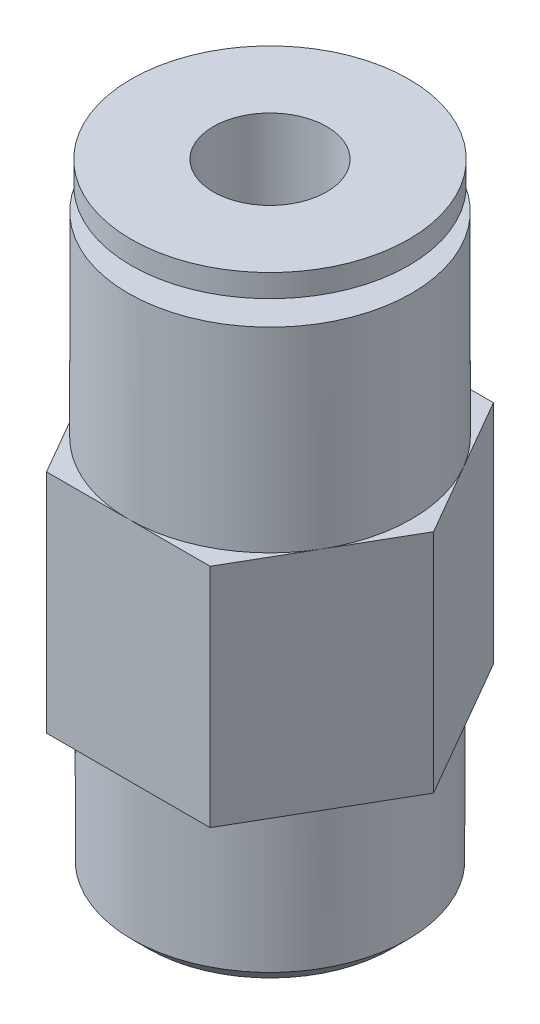
ISO-10303-21;
HEADER;
FILE_DESCRIPTION(('STEP AP214'),'2;1');
FILE_NAME('part.step','',(''),(''),'','','');
FILE_SCHEMA(('AUTOMOTIVE_DESIGN { 1 0 10303 214 1 1 1 1 }'));
ENDSEC;
DATA;
#1=APPLICATION_CONTEXT('core data for automotive mechanical design processes');
#2=APPLICATION_PROTOCOL_DEFINITION('international standard','automotive_design',2000,#1);
#3=PRODUCT_CONTEXT('',#1,'mechanical');
#4=PRODUCT('Part','Part','',(#3));
#5=PRODUCT_RELATED_PRODUCT_CATEGORY('part','',(#4));
#6=PRODUCT_DEFINITION_FORMATION('','',#4);
#7=PRODUCT_DEFINITION_CONTEXT('part definition',#1,'design');
#8=PRODUCT_DEFINITION('design','',#6,#7);
#9=PRODUCT_DEFINITION_SHAPE('','',#8);
#10=(LENGTH_UNIT() NAMED_UNIT(*) SI_UNIT(.MILLI.,.METRE.));
#11=(NAMED_UNIT(*) PLANE_ANGLE_UNIT() SI_UNIT($,.RADIAN.));
#12=(NAMED_UNIT(*) SI_UNIT($,.STERADIAN.) SOLID_ANGLE_UNIT());
#13=UNCERTAINTY_MEASURE_WITH_UNIT(LENGTH_MEASURE(1.E-05),#10,'distance_accuracy_value','');
#14=(GEOMETRIC_REPRESENTATION_CONTEXT(3) GLOBAL_UNCERTAINTY_ASSIGNED_CONTEXT((#13)) GLOBAL_UNIT_ASSIGNED_CONTEXT((#10,
#11,#12)) REPRESENTATION_CONTEXT('',''));
#15=CARTESIAN_POINT('',(0.,0.,0.));
#16=DIRECTION('',(0.,0.,1.));
#17=DIRECTION('',(1.,0.,0.));
#18=AXIS2_PLACEMENT_3D('',#15,#16,#17);
#19=CARTESIAN_POINT('',(4.33642210820387,0.,-4.285));
#20=DIRECTION('',(0.,-1.,0.));
#21=DIRECTION('',(0.,0.,1.));
#22=AXIS2_PLACEMENT_3D('',#19,#20,#21);
#23=PLANE('',#22);
#24=CARTESIAN_POINT('',(0.,0.,0.));
#25=DIRECTION('',(0.,1.,0.));
#26=DIRECTION('',(0.,0.,1.));
#27=AXIS2_PLACEMENT_3D('',#24,#25,#26);
#28=CIRCLE('',#27,4.28499999999999);
#29=CARTESIAN_POINT('',(0.,0.,4.28499999999999));
#30=VERTEX_POINT('',#29);
#31=EDGE_CURVE('E19',#30,#30,#28,.T.);
#32=ORIENTED_EDGE('',*,*,#31,.F.);
#33=EDGE_LOOP('',(#32));
#34=FACE_BOUND('',#33,.T.);
#35=ADVANCED_FACE('F16',(#34),#23,.T.);
#36=CARTESIAN_POINT('',(0.,0.,0.));
#37=DIRECTION('',(0.,1.,0.));
#38=DIRECTION('',(0.,0.,1.));
#39=AXIS2_PLACEMENT_3D('',#36,#37,#38);
#40=CONICAL_SURFACE('',#39,4.28499999999999,0.785398163397448);
#41=CARTESIAN_POINT('',(0.,0.58,0.));
#42=DIRECTION('',(0.,1.,0.));
#43=DIRECTION('',(0.,0.,-1.));
#44=AXIS2_PLACEMENT_3D('',#41,#42,#43);
#45=CIRCLE('',#44,4.865);
#46=CARTESIAN_POINT('',(0.,0.58,-4.865));
#47=VERTEX_POINT('',#46);
#48=EDGE_CURVE('E148',#47,#47,#45,.T.);
#49=ORIENTED_EDGE('',*,*,#48,.F.);
#50=EDGE_LOOP('',(#49));
#51=FACE_BOUND('',#50,.T.);
#52=ORIENTED_EDGE('',*,*,#31,.T.);
#53=EDGE_LOOP('',(#52));
#54=FACE_BOUND('',#53,.T.);
#55=ADVANCED_FACE('F418',(#51,#54),#40,.T.);
#56=CARTESIAN_POINT('',(0.,5.51,0.));
#57=DIRECTION('',(0.,1.,0.));
#58=DIRECTION('',(-1.,0.,0.));
#59=AXIS2_PLACEMENT_3D('',#56,#57,#58);
#60=CYLINDRICAL_SURFACE('',#59,4.865);
#61=CARTESIAN_POINT('',(0.,5.51,0.));
#62=DIRECTION('',(0.,1.,0.));
#63=DIRECTION('',(-1.,0.,0.));
#64=AXIS2_PLACEMENT_3D('',#61,#62,#63);
#65=CIRCLE('',#64,4.865);
#66=CARTESIAN_POINT('',(-4.865,5.51,0.));
#67=VERTEX_POINT('',#66);
#68=EDGE_CURVE('E145',#67,#67,#65,.T.);
#69=ORIENTED_EDGE('',*,*,#68,.F.);
#70=EDGE_LOOP('',(#69));
#71=FACE_BOUND('',#70,.T.);
#72=ORIENTED_EDGE('',*,*,#48,.T.);
#73=EDGE_LOOP('',(#72));
#74=FACE_BOUND('',#73,.T.);
#75=ADVANCED_FACE('F411',(#71,#74),#60,.T.);
#76=CARTESIAN_POINT('',(-5.84278472419902,5.51,5.));
#77=DIRECTION('',(0.,-1.,0.));
#78=DIRECTION('',(0.,0.,-1.));
#79=AXIS2_PLACEMENT_3D('',#76,#77,#78);
#80=PLANE('',#79);
#81=ORIENTED_EDGE('',*,*,#68,.T.);
#82=EDGE_LOOP('',(#81));
#83=FACE_BOUND('',#82,.T.);
#84=DIRECTION('',(-1.,0.,0.));
#85=VECTOR('',#84,1.);
#86=CARTESIAN_POINT('',(0.,5.51,-5.));
#87=LINE('',#86,#85);
#88=CARTESIAN_POINT('',(2.88675134594813,5.51,-5.));
#89=VERTEX_POINT('',#88);
#90=CARTESIAN_POINT('',(-2.88675134594813,5.51,-5.));
#91=VERTEX_POINT('',#90);
#92=EDGE_CURVE('E528',#89,#91,#87,.T.);
#93=ORIENTED_EDGE('',*,*,#92,.F.);
#94=DIRECTION('',(-0.5,0.,-0.866025403784438));
#95=VECTOR('',#94,1.);
#96=CARTESIAN_POINT('',(4.3301270189222,5.51,-2.5));
#97=LINE('',#96,#95);
#98=CARTESIAN_POINT('',(5.77350269189626,5.51,0.));
#99=VERTEX_POINT('',#98);
#100=EDGE_CURVE('E526',#99,#89,#97,.T.);
#101=ORIENTED_EDGE('',*,*,#100,.F.);
#102=DIRECTION('',(0.5,0.,-0.866025403784438));
#103=VECTOR('',#102,1.);
#104=CARTESIAN_POINT('',(4.3301270189222,5.51,2.5));
#105=LINE('',#104,#103);
#106=CARTESIAN_POINT('',(2.88675134594813,5.51,5.));
#107=VERTEX_POINT('',#106);
#108=EDGE_CURVE('E535',#107,#99,#105,.T.);
#109=ORIENTED_EDGE('',*,*,#108,.F.);
#110=DIRECTION('',(1.,0.,0.));
#111=VECTOR('',#110,1.);
#112=CARTESIAN_POINT('',(0.,5.51,5.));
#113=LINE('',#112,#111);
#114=CARTESIAN_POINT('',(-2.88675134594813,5.51,5.));
#115=VERTEX_POINT('',#114);
#116=EDGE_CURVE('E541',#115,#107,#113,.T.);
#117=ORIENTED_EDGE('',*,*,#116,.F.);
#118=DIRECTION('',(0.5,0.,0.866025403784438));
#119=VECTOR('',#118,1.);
#120=CARTESIAN_POINT('',(-4.3301270189222,5.51,2.5));
#121=LINE('',#120,#119);
#122=CARTESIAN_POINT('',(-5.77350269189626,5.51,0.));
#123=VERTEX_POINT('',#122);
#124=EDGE_CURVE('E120',#123,#115,#121,.T.);
#125=ORIENTED_EDGE('',*,*,#124,.F.);
#126=DIRECTION('',(-0.5,0.,0.866025403784438));
#127=VECTOR('',#126,1.);
#128=CARTESIAN_POINT('',(-4.3301270189222,5.51,-2.5));
#129=LINE('',#128,#127);
#130=EDGE_CURVE('E147',#91,#123,#129,.T.);
#131=ORIENTED_EDGE('',*,*,#130,.F.);
#132=EDGE_LOOP('',(#93,#101,#109,#117,#125,#131));
#133=FACE_BOUND('',#132,.T.);
#134=ADVANCED_FACE('F404',(#83,#133),#80,.T.);
#135=CARTESIAN_POINT('',(-5.77350269189626,13.5,0.));
#136=DIRECTION('',(-0.866025403784438,0.,-0.5));
#137=DIRECTION('',(0.5,0.,-0.866025403784438));
#138=AXIS2_PLACEMENT_3D('',#135,#136,#137);
#139=PLANE('',#138);
#140=DIRECTION('',(0.5,0.,-0.866025403784438));
#141=VECTOR('',#140,1.);
#142=CARTESIAN_POINT('',(-4.3301270189222,13.5,-2.5));
#143=LINE('',#142,#141);
#144=CARTESIAN_POINT('',(-4.33084668399926,13.5,-2.49875350352209));
#145=VERTEX_POINT('',#144);
#146=CARTESIAN_POINT('',(-4.32940740720315,13.5,-2.5012464040591));
#147=VERTEX_POINT('',#146);
#148=EDGE_CURVE('E32',#145,#147,#143,.T.);
#149=ORIENTED_EDGE('',*,*,#148,.T.);
#150=CARTESIAN_POINT('',(-2.88675134594813,13.5,-5.));
#151=CARTESIAN_POINT('',(-2.94689199898872,13.5,-4.89583333333333));
#152=CARTESIAN_POINT('',(-3.0070326520293,13.5,-4.79166666666667));
#153=CARTESIAN_POINT('',(-3.12731395811047,13.5,-4.58333333333333));
#154=CARTESIAN_POINT('',(-3.18745461115106,13.5,-4.47916666666667));
#155=CARTESIAN_POINT('',(-3.30773591723223,13.5,-4.27083333333333));
#156=CARTESIAN_POINT('',(-3.36787657027282,13.5,-4.16666666666667));
#157=CARTESIAN_POINT('',(-3.48815787635399,13.5,-3.95833333333333));
#158=CARTESIAN_POINT('',(-3.54829852939457,13.5,-3.85416666666667));
#159=CARTESIAN_POINT('',(-3.66857983547575,13.5,-3.64583333333333));
#160=CARTESIAN_POINT('',(-3.72872048851633,13.5,-3.54166666666667));
#161=CARTESIAN_POINT('',(-3.8490017945975,13.5,-3.33333333333333));
#162=CARTESIAN_POINT('',(-3.90914244763809,13.5,-3.22916666666667));
#163=CARTESIAN_POINT('',(-4.02942375371926,13.5,-3.02083333333333));
#164=CARTESIAN_POINT('',(-4.08956440675985,13.5,-2.91666666666667));
#165=CARTESIAN_POINT('',(-4.20984571284102,13.5,-2.70833333333333));
#166=CARTESIAN_POINT('',(-4.2699863658816,13.5,-2.60416666666667));
#167=CARTESIAN_POINT('',(-4.33012701892219,13.5,-2.5));
#168=B_SPLINE_CURVE_WITH_KNOTS('',3,(#150,#151,#152,#153,#154,#155,#156,#157,#158,#159,#160,
#161,#162,#163,#164,#165,#166,#167),.UNSPECIFIED.,.F.,.F.,(4,2,2,2,2,2,2,2,4),(0.,
0.360843918243515,0.721687836487032,1.08253175473055,1.44337567297406,1.80421959121758,
2.1650635094611,2.52590742770461,2.88675134594813),.UNSPECIFIED.);
#169=CARTESIAN_POINT('',(-2.88675134594813,13.5,-5.));
#170=VERTEX_POINT('',#169);
#171=EDGE_CURVE('E506',#170,#147,#168,.T.);
#172=ORIENTED_EDGE('',*,*,#171,.F.);
#173=DIRECTION('',(0.,-1.,0.));
#174=VECTOR('',#173,1.);
#175=CARTESIAN_POINT('',(-2.88675134594813,13.5,-5.));
#176=LINE('',#175,#174);
#177=EDGE_CURVE('E519',#91,#170,#176,.F.);
#178=ORIENTED_EDGE('',*,*,#177,.F.);
#179=ORIENTED_EDGE('',*,*,#130,.T.);
#180=DIRECTION('',(0.,-1.,0.));
#181=VECTOR('',#180,1.);
#182=CARTESIAN_POINT('',(-5.77350269189626,13.5,0.));
#183=LINE('',#182,#181);
#184=CARTESIAN_POINT('',(-5.77350260856258,13.5,-1.44338168587416E-07));
#185=VERTEX_POINT('',#184);
#186=EDGE_CURVE('E119',#185,#123,#183,.T.);
#187=ORIENTED_EDGE('',*,*,#186,.F.);
#188=CARTESIAN_POINT('',(-4.33012701892219,13.5,-2.5));
#189=CARTESIAN_POINT('',(-4.39026767196278,13.5,-2.39583333333333));
#190=CARTESIAN_POINT('',(-4.45040832500336,13.5,-2.29166666666667));
#191=CARTESIAN_POINT('',(-4.57068963108453,13.5,-2.08333333333333));
#192=CARTESIAN_POINT('',(-4.63083028412512,13.5,-1.97916666666667));
#193=CARTESIAN_POINT('',(-4.75111159020629,13.5,-1.77083333333333));
#194=CARTESIAN_POINT('',(-4.81125224324688,13.5,-1.66666666666667));
#195=CARTESIAN_POINT('',(-4.93153354932805,13.5,-1.45833333333333));
#196=CARTESIAN_POINT('',(-4.99167420236864,13.5,-1.35416666666667));
#197=CARTESIAN_POINT('',(-5.11195550844981,13.5,-1.14583333333333));
#198=CARTESIAN_POINT('',(-5.1720961614904,13.5,-1.04166666666667));
#199=CARTESIAN_POINT('',(-5.29237746757157,13.5,-0.833333333333333));
#200=CARTESIAN_POINT('',(-5.35251812061216,13.5,-0.729166666666667));
#201=CARTESIAN_POINT('',(-5.47279942669333,13.5,-0.520833333333333));
#202=CARTESIAN_POINT('',(-5.53294007973392,13.5,-0.416666666666667));
#203=CARTESIAN_POINT('',(-5.65322138581509,13.5,-0.208333333333333));
#204=CARTESIAN_POINT('',(-5.71336203885567,13.5,-0.104166666666666));
#205=CARTESIAN_POINT('',(-5.77350269189626,13.5,0.));
#206=B_SPLINE_CURVE_WITH_KNOTS('',3,(#188,#189,#190,#191,#192,#193,#194,#195,#196,#197,#198,
#199,#200,#201,#202,#203,#204,#205),.UNSPECIFIED.,.F.,.F.,(4,2,2,2,2,2,2,2,4),(0.,
0.360843918243517,0.721687836487033,1.08253175473055,1.44337567297407,1.80421959121758,
2.1650635094611,2.52590742770462,2.88675134594813),.UNSPECIFIED.);
#207=EDGE_CURVE('E509',#145,#185,#206,.T.);
#208=ORIENTED_EDGE('',*,*,#207,.F.);
#209=EDGE_LOOP('',(#149,#172,#178,#179,#187,#208));
#210=FACE_BOUND('',#209,.T.);
#211=ADVANCED_FACE('F397',(#210),#139,.T.);
#212=CARTESIAN_POINT('',(-2.88675134594813,13.5,5.));
#213=DIRECTION('',(-0.866025403784438,0.,0.5));
#214=DIRECTION('',(-0.5,0.,-0.866025403784438));
#215=AXIS2_PLACEMENT_3D('',#212,#213,#214);
#216=PLANE('',#215);
#217=DIRECTION('',(-0.5,0.,-0.866025403784438));
#218=VECTOR('',#217,1.);
#219=CARTESIAN_POINT('',(-4.3301270189222,13.5,2.5));
#220=LINE('',#219,#218);
#221=CARTESIAN_POINT('',(-4.32940735501036,13.5,2.50124649445966));
#222=VERTEX_POINT('',#221);
#223=CARTESIAN_POINT('',(-4.33084663180655,13.5,2.49875359392251));
#224=VERTEX_POINT('',#223);
#225=EDGE_CURVE('E41',#222,#224,#220,.T.);
#226=ORIENTED_EDGE('',*,*,#225,.T.);
#227=CARTESIAN_POINT('',(-5.77350269189626,13.5,0.));
#228=CARTESIAN_POINT('',(-5.71336203885567,13.5,0.104166666666666));
#229=CARTESIAN_POINT('',(-5.65322138581509,13.5,0.208333333333333));
#230=CARTESIAN_POINT('',(-5.53294007973392,13.5,0.416666666666667));
#231=CARTESIAN_POINT('',(-5.47279942669333,13.5,0.520833333333333));
#232=CARTESIAN_POINT('',(-5.35251812061216,13.5,0.729166666666667));
#233=CARTESIAN_POINT('',(-5.29237746757157,13.5,0.833333333333333));
#234=CARTESIAN_POINT('',(-5.1720961614904,13.5,1.04166666666667));
#235=CARTESIAN_POINT('',(-5.11195550844981,13.5,1.14583333333333));
#236=CARTESIAN_POINT('',(-4.99167420236864,13.5,1.35416666666667));
#237=CARTESIAN_POINT('',(-4.93153354932805,13.5,1.45833333333333));
#238=CARTESIAN_POINT('',(-4.81125224324688,13.5,1.66666666666667));
#239=CARTESIAN_POINT('',(-4.75111159020629,13.5,1.77083333333333));
#240=CARTESIAN_POINT('',(-4.63083028412512,13.5,1.97916666666667));
#241=CARTESIAN_POINT('',(-4.57068963108453,13.5,2.08333333333333));
#242=CARTESIAN_POINT('',(-4.45040832500336,13.5,2.29166666666667));
#243=CARTESIAN_POINT('',(-4.39026767196278,13.5,2.39583333333333));
#244=CARTESIAN_POINT('',(-4.33012701892219,13.5,2.5));
#245=B_SPLINE_CURVE_WITH_KNOTS('',3,(#227,#228,#229,#230,#231,#232,#233,#234,#235,#236,#237,
#238,#239,#240,#241,#242,#243,#244),.UNSPECIFIED.,.F.,.F.,(4,2,2,2,2,2,2,2,4),(0.,
0.360843918243516,0.721687836487033,1.08253175473055,1.44337567297407,1.80421959121758,
2.1650635094611,2.52590742770462,2.88675134594813),.UNSPECIFIED.);
#246=EDGE_CURVE('E132',#185,#224,#245,.T.);
#247=ORIENTED_EDGE('',*,*,#246,.F.);
#248=ORIENTED_EDGE('',*,*,#186,.T.);
#249=ORIENTED_EDGE('',*,*,#124,.T.);
#250=DIRECTION('',(0.,-1.,0.));
#251=VECTOR('',#250,1.);
#252=CARTESIAN_POINT('',(-2.88675134594813,13.5,5.));
#253=LINE('',#252,#251);
#254=CARTESIAN_POINT('',(-2.88675134594813,13.5,5.));
#255=VERTEX_POINT('',#254);
#256=EDGE_CURVE('E127',#255,#115,#253,.T.);
#257=ORIENTED_EDGE('',*,*,#256,.F.);
#258=CARTESIAN_POINT('',(-4.33012701892219,13.5,2.5));
#259=CARTESIAN_POINT('',(-4.2699863658816,13.5,2.60416666666667));
#260=CARTESIAN_POINT('',(-4.20984571284102,13.5,2.70833333333333));
#261=CARTESIAN_POINT('',(-4.08956440675985,13.5,2.91666666666667));
#262=CARTESIAN_POINT('',(-4.02942375371926,13.5,3.02083333333333));
#263=CARTESIAN_POINT('',(-3.90914244763809,13.5,3.22916666666667));
#264=CARTESIAN_POINT('',(-3.8490017945975,13.5,3.33333333333333));
#265=CARTESIAN_POINT('',(-3.72872048851633,13.5,3.54166666666667));
#266=CARTESIAN_POINT('',(-3.66857983547575,13.5,3.64583333333333));
#267=CARTESIAN_POINT('',(-3.54829852939457,13.5,3.85416666666667));
#268=CARTESIAN_POINT('',(-3.48815787635399,13.5,3.95833333333333));
#269=CARTESIAN_POINT('',(-3.36787657027282,13.5,4.16666666666667));
#270=CARTESIAN_POINT('',(-3.30773591723223,13.5,4.27083333333333));
#271=CARTESIAN_POINT('',(-3.18745461115106,13.5,4.47916666666667));
#272=CARTESIAN_POINT('',(-3.12731395811047,13.5,4.58333333333333));
#273=CARTESIAN_POINT('',(-3.0070326520293,13.5,4.79166666666667));
#274=CARTESIAN_POINT('',(-2.94689199898872,13.5,4.89583333333333));
#275=CARTESIAN_POINT('',(-2.88675134594813,13.5,5.));
#276=B_SPLINE_CURVE_WITH_KNOTS('',3,(#258,#259,#260,#261,#262,#263,#264,#265,#266,#267,#268,
#269,#270,#271,#272,#273,#274,#275),.UNSPECIFIED.,.F.,.F.,(4,2,2,2,2,2,2,2,4),(0.,
0.360843918243516,0.721687836487031,1.08253175473055,1.44337567297406,1.80421959121758,
2.16506350946109,2.52590742770461,2.88675134594813),.UNSPECIFIED.);
#277=EDGE_CURVE('E123',#222,#255,#276,.T.);
#278=ORIENTED_EDGE('',*,*,#277,.F.);
#279=EDGE_LOOP('',(#226,#247,#248,#249,#257,#278));
#280=FACE_BOUND('',#279,.T.);
#281=ADVANCED_FACE('F124',(#280),#216,.T.);
#282=CARTESIAN_POINT('',(2.88675134594813,13.5,5.));
#283=DIRECTION('',(0.,0.,1.));
#284=DIRECTION('',(-1.,0.,0.));
#285=AXIS2_PLACEMENT_3D('',#282,#283,#284);
#286=PLANE('',#285);
#287=DIRECTION('',(1.,0.,0.));
#288=VECTOR('',#287,1.);
#289=CARTESIAN_POINT('',(-4.33012701892219,13.5,5.));
#290=LINE('',#289,#288);
#291=CARTESIAN_POINT('',(0.,13.5,5.));
#292=VERTEX_POINT('',#291);
#293=EDGE_CURVE('E131',#255,#292,#290,.T.);
#294=ORIENTED_EDGE('',*,*,#293,.F.);
#295=ORIENTED_EDGE('',*,*,#256,.T.);
#296=ORIENTED_EDGE('',*,*,#116,.T.);
#297=DIRECTION('',(0.,-1.,0.));
#298=VECTOR('',#297,1.);
#299=CARTESIAN_POINT('',(2.88675134594813,13.5,5.));
#300=LINE('',#299,#298);
#301=CARTESIAN_POINT('',(2.88675134594813,13.5,5.));
#302=VERTEX_POINT('',#301);
#303=EDGE_CURVE('E534',#302,#107,#300,.T.);
#304=ORIENTED_EDGE('',*,*,#303,.F.);
#305=DIRECTION('',(1.,0.,0.));
#306=VECTOR('',#305,1.);
#307=CARTESIAN_POINT('',(0.,13.5,5.));
#308=LINE('',#307,#306);
#309=EDGE_CURVE('E574',#292,#302,#308,.T.);
#310=ORIENTED_EDGE('',*,*,#309,.F.);
#311=EDGE_LOOP('',(#294,#295,#296,#304,#310));
#312=FACE_BOUND('',#311,.T.);
#313=ADVANCED_FACE('F382',(#312),#286,.T.);
#314=CARTESIAN_POINT('',(5.77350269189626,13.5,0.));
#315=DIRECTION('',(0.866025403784438,0.,0.5));
#316=DIRECTION('',(-0.5,0.,0.866025403784438));
#317=AXIS2_PLACEMENT_3D('',#314,#315,#316);
#318=PLANE('',#317);
#319=DIRECTION('',(-0.5,0.,0.866025403784438));
#320=VECTOR('',#319,1.);
#321=CARTESIAN_POINT('',(4.3301270189222,13.5,2.5));
#322=LINE('',#321,#320);
#323=CARTESIAN_POINT('',(4.33084668400179,13.5,2.4987535035177));
#324=VERTEX_POINT('',#323);
#325=CARTESIAN_POINT('',(4.3294074072029,13.5,2.50124640405954));
#326=VERTEX_POINT('',#325);
#327=EDGE_CURVE('E184',#324,#326,#322,.T.);
#328=ORIENTED_EDGE('',*,*,#327,.T.);
#329=CARTESIAN_POINT('',(2.88675134594813,13.5,5.));
#330=CARTESIAN_POINT('',(2.94689199898872,13.5,4.89583333333333));
#331=CARTESIAN_POINT('',(3.0070326520293,13.5,4.79166666666667));
#332=CARTESIAN_POINT('',(3.12731395811047,13.5,4.58333333333333));
#333=CARTESIAN_POINT('',(3.18745461115106,13.5,4.47916666666667));
#334=CARTESIAN_POINT('',(3.30773591723223,13.5,4.27083333333333));
#335=CARTESIAN_POINT('',(3.36787657027282,13.5,4.16666666666667));
#336=CARTESIAN_POINT('',(3.48815787635399,13.5,3.95833333333333));
#337=CARTESIAN_POINT('',(3.54829852939457,13.5,3.85416666666667));
#338=CARTESIAN_POINT('',(3.66857983547575,13.5,3.64583333333333));
#339=CARTESIAN_POINT('',(3.72872048851633,13.5,3.54166666666667));
#340=CARTESIAN_POINT('',(3.8490017945975,13.5,3.33333333333333));
#341=CARTESIAN_POINT('',(3.90914244763809,13.5,3.22916666666667));
#342=CARTESIAN_POINT('',(4.02942375371926,13.5,3.02083333333333));
#343=CARTESIAN_POINT('',(4.08956440675985,13.5,2.91666666666667));
#344=CARTESIAN_POINT('',(4.20984571284102,13.5,2.70833333333333));
#345=CARTESIAN_POINT('',(4.2699863658816,13.5,2.60416666666667));
#346=CARTESIAN_POINT('',(4.33012701892219,13.5,2.5));
#347=B_SPLINE_CURVE_WITH_KNOTS('',3,(#329,#330,#331,#332,#333,#334,#335,#336,#337,#338,#339,
#340,#341,#342,#343,#344,#345,#346),.UNSPECIFIED.,.F.,.F.,(4,2,2,2,2,2,2,2,4),(0.,
0.360843918243515,0.721687836487032,1.08253175473055,1.44337567297406,1.80421959121758,
2.1650635094611,2.52590742770461,2.88675134594813),.UNSPECIFIED.);
#348=EDGE_CURVE('E198',#302,#326,#347,.T.);
#349=ORIENTED_EDGE('',*,*,#348,.F.);
#350=ORIENTED_EDGE('',*,*,#303,.T.);
#351=ORIENTED_EDGE('',*,*,#108,.T.);
#352=DIRECTION('',(0.,-1.,0.));
#353=VECTOR('',#352,1.);
#354=CARTESIAN_POINT('',(5.77350269189626,13.5,0.));
#355=LINE('',#354,#353);
#356=CARTESIAN_POINT('',(5.77350260856258,13.5,1.44338168587416E-07));
#357=VERTEX_POINT('',#356);
#358=EDGE_CURVE('E525',#357,#99,#355,.T.);
#359=ORIENTED_EDGE('',*,*,#358,.F.);
#360=CARTESIAN_POINT('',(4.33012701892219,13.5,2.5));
#361=CARTESIAN_POINT('',(4.39026767196278,13.5,2.39583333333333));
#362=CARTESIAN_POINT('',(4.45040832500336,13.5,2.29166666666667));
#363=CARTESIAN_POINT('',(4.57068963108453,13.5,2.08333333333333));
#364=CARTESIAN_POINT('',(4.63083028412512,13.5,1.97916666666667));
#365=CARTESIAN_POINT('',(4.75111159020629,13.5,1.77083333333333));
#366=CARTESIAN_POINT('',(4.81125224324688,13.5,1.66666666666667));
#367=CARTESIAN_POINT('',(4.93153354932805,13.5,1.45833333333333));
#368=CARTESIAN_POINT('',(4.99167420236864,13.5,1.35416666666667));
#369=CARTESIAN_POINT('',(5.11195550844981,13.5,1.14583333333333));
#370=CARTESIAN_POINT('',(5.1720961614904,13.5,1.04166666666667));
#371=CARTESIAN_POINT('',(5.29237746757157,13.5,0.833333333333333));
#372=CARTESIAN_POINT('',(5.35251812061216,13.5,0.729166666666667));
#373=CARTESIAN_POINT('',(5.47279942669333,13.5,0.520833333333333));
#374=CARTESIAN_POINT('',(5.53294007973392,13.5,0.416666666666667));
#375=CARTESIAN_POINT('',(5.65322138581509,13.5,0.208333333333333));
#376=CARTESIAN_POINT('',(5.71336203885567,13.5,0.104166666666666));
#377=CARTESIAN_POINT('',(5.77350269189626,13.5,0.));
#378=B_SPLINE_CURVE_WITH_KNOTS('',3,(#360,#361,#362,#363,#364,#365,#366,#367,#368,#369,#370,
#371,#372,#373,#374,#375,#376,#377),.UNSPECIFIED.,.F.,.F.,(4,2,2,2,2,2,2,2,4),(0.,
0.360843918243517,0.721687836487033,1.08253175473055,1.44337567297407,1.80421959121758,
2.1650635094611,2.52590742770462,2.88675134594813),.UNSPECIFIED.);
#379=EDGE_CURVE('E190',#324,#357,#378,.T.);
#380=ORIENTED_EDGE('',*,*,#379,.F.);
#381=EDGE_LOOP('',(#328,#349,#350,#351,#359,#380));
#382=FACE_BOUND('',#381,.T.);
#383=ADVANCED_FACE('F375',(#382),#318,.T.);
#384=CARTESIAN_POINT('',(2.88675134594813,13.5,-5.));
#385=DIRECTION('',(0.866025403784438,0.,-0.5));
#386=DIRECTION('',(0.5,0.,0.866025403784438));
#387=AXIS2_PLACEMENT_3D('',#384,#385,#386);
#388=PLANE('',#387);
#389=DIRECTION('',(0.5,0.,0.866025403784438));
#390=VECTOR('',#389,1.);
#391=CARTESIAN_POINT('',(4.3301270189222,13.5,-2.5));
#392=LINE('',#391,#390);
#393=CARTESIAN_POINT('',(4.32940735500891,13.5,-2.50124649446218));
#394=VERTEX_POINT('',#393);
#395=CARTESIAN_POINT('',(4.33084663181055,13.5,-2.49875359391558));
#396=VERTEX_POINT('',#395);
#397=EDGE_CURVE('E183',#394,#396,#392,.T.);
#398=ORIENTED_EDGE('',*,*,#397,.T.);
#399=CARTESIAN_POINT('',(5.77350269189626,13.5,0.));
#400=CARTESIAN_POINT('',(5.71336203885567,13.5,-0.104166666666666));
#401=CARTESIAN_POINT('',(5.65322138581509,13.5,-0.208333333333333));
#402=CARTESIAN_POINT('',(5.53294007973392,13.5,-0.416666666666667));
#403=CARTESIAN_POINT('',(5.47279942669333,13.5,-0.520833333333333));
#404=CARTESIAN_POINT('',(5.35251812061216,13.5,-0.729166666666667));
#405=CARTESIAN_POINT('',(5.29237746757157,13.5,-0.833333333333333));
#406=CARTESIAN_POINT('',(5.1720961614904,13.5,-1.04166666666667));
#407=CARTESIAN_POINT('',(5.11195550844981,13.5,-1.14583333333333));
#408=CARTESIAN_POINT('',(4.99167420236864,13.5,-1.35416666666667));
#409=CARTESIAN_POINT('',(4.93153354932805,13.5,-1.45833333333333));
#410=CARTESIAN_POINT('',(4.81125224324688,13.5,-1.66666666666667));
#411=CARTESIAN_POINT('',(4.75111159020629,13.5,-1.77083333333333));
#412=CARTESIAN_POINT('',(4.63083028412512,13.5,-1.97916666666667));
#413=CARTESIAN_POINT('',(4.57068963108453,13.5,-2.08333333333333));
#414=CARTESIAN_POINT('',(4.45040832500336,13.5,-2.29166666666667));
#415=CARTESIAN_POINT('',(4.39026767196278,13.5,-2.39583333333333));
#416=CARTESIAN_POINT('',(4.33012701892219,13.5,-2.5));
#417=B_SPLINE_CURVE_WITH_KNOTS('',3,(#399,#400,#401,#402,#403,#404,#405,#406,#407,#408,#409,
#410,#411,#412,#413,#414,#415,#416),.UNSPECIFIED.,.F.,.F.,(4,2,2,2,2,2,2,2,4),(0.,
0.360843918243516,0.721687836487033,1.08253175473055,1.44337567297407,1.80421959121758,
2.1650635094611,2.52590742770462,2.88675134594813),.UNSPECIFIED.);
#418=EDGE_CURVE('E192',#357,#396,#417,.T.);
#419=ORIENTED_EDGE('',*,*,#418,.F.);
#420=ORIENTED_EDGE('',*,*,#358,.T.);
#421=ORIENTED_EDGE('',*,*,#100,.T.);
#422=DIRECTION('',(0.,-1.,0.));
#423=VECTOR('',#422,1.);
#424=CARTESIAN_POINT('',(2.88675134594813,13.5,-5.));
#425=LINE('',#424,#423);
#426=CARTESIAN_POINT('',(2.88675134594813,13.5,-5.));
#427=VERTEX_POINT('',#426);
#428=EDGE_CURVE('E65',#427,#89,#425,.T.);
#429=ORIENTED_EDGE('',*,*,#428,.F.);
#430=CARTESIAN_POINT('',(4.33012701892219,13.5,-2.5));
#431=CARTESIAN_POINT('',(4.2699863658816,13.5,-2.60416666666667));
#432=CARTESIAN_POINT('',(4.20984571284102,13.5,-2.70833333333333));
#433=CARTESIAN_POINT('',(4.08956440675985,13.5,-2.91666666666667));
#434=CARTESIAN_POINT('',(4.02942375371926,13.5,-3.02083333333333));
#435=CARTESIAN_POINT('',(3.90914244763809,13.5,-3.22916666666667));
#436=CARTESIAN_POINT('',(3.8490017945975,13.5,-3.33333333333333));
#437=CARTESIAN_POINT('',(3.72872048851633,13.5,-3.54166666666667));
#438=CARTESIAN_POINT('',(3.66857983547575,13.5,-3.64583333333333));
#439=CARTESIAN_POINT('',(3.54829852939457,13.5,-3.85416666666667));
#440=CARTESIAN_POINT('',(3.48815787635399,13.5,-3.95833333333333));
#441=CARTESIAN_POINT('',(3.36787657027282,13.5,-4.16666666666667));
#442=CARTESIAN_POINT('',(3.30773591723223,13.5,-4.27083333333333));
#443=CARTESIAN_POINT('',(3.18745461115106,13.5,-4.47916666666667));
#444=CARTESIAN_POINT('',(3.12731395811047,13.5,-4.58333333333333));
#445=CARTESIAN_POINT('',(3.0070326520293,13.5,-4.79166666666667));
#446=CARTESIAN_POINT('',(2.94689199898872,13.5,-4.89583333333333));
#447=CARTESIAN_POINT('',(2.88675134594813,13.5,-5.));
#448=B_SPLINE_CURVE_WITH_KNOTS('',3,(#430,#431,#432,#433,#434,#435,#436,#437,#438,#439,#440,
#441,#442,#443,#444,#445,#446,#447),.UNSPECIFIED.,.F.,.F.,(4,2,2,2,2,2,2,2,4),(0.,
0.360843918243516,0.721687836487031,1.08253175473055,1.44337567297406,1.80421959121758,
2.16506350946109,2.52590742770461,2.88675134594813),.UNSPECIFIED.);
#449=EDGE_CURVE('E194',#394,#427,#448,.T.);
#450=ORIENTED_EDGE('',*,*,#449,.F.);
#451=EDGE_LOOP('',(#398,#419,#420,#421,#429,#450));
#452=FACE_BOUND('',#451,.T.);
#453=ADVANCED_FACE('F368',(#452),#388,.T.);
#454=CARTESIAN_POINT('',(-2.88675134594813,13.5,-5.));
#455=DIRECTION('',(0.,0.,-1.));
#456=DIRECTION('',(1.,0.,0.));
#457=AXIS2_PLACEMENT_3D('',#454,#455,#456);
#458=PLANE('',#457);
#459=DIRECTION('',(1.,0.,0.));
#460=VECTOR('',#459,1.);
#461=CARTESIAN_POINT('',(0.,13.5,-5.));
#462=LINE('',#461,#460);
#463=CARTESIAN_POINT('',(0.,13.5,-5.));
#464=VERTEX_POINT('',#463);
#465=EDGE_CURVE('E144',#427,#464,#462,.F.);
#466=ORIENTED_EDGE('',*,*,#465,.F.);
#467=ORIENTED_EDGE('',*,*,#428,.T.);
#468=ORIENTED_EDGE('',*,*,#92,.T.);
#469=ORIENTED_EDGE('',*,*,#177,.T.);
#470=DIRECTION('',(1.,0.,0.));
#471=VECTOR('',#470,1.);
#472=CARTESIAN_POINT('',(-4.33012701892219,13.5,-5.));
#473=LINE('',#472,#471);
#474=EDGE_CURVE('E54',#464,#170,#473,.F.);
#475=ORIENTED_EDGE('',*,*,#474,.F.);
#476=EDGE_LOOP('',(#466,#467,#468,#469,#475));
#477=FACE_BOUND('',#476,.T.);
#478=ADVANCED_FACE('F360',(#477),#458,.T.);
#479=CARTESIAN_POINT('',(-4.35538385164637,13.5,-5.));
#480=DIRECTION('',(0.,1.,0.));
#481=DIRECTION('',(0.,0.,1.));
#482=AXIS2_PLACEMENT_3D('',#479,#480,#481);
#483=PLANE('',#482);
#484=ORIENTED_EDGE('',*,*,#474,.T.);
#485=ORIENTED_EDGE('',*,*,#171,.T.);
#486=CARTESIAN_POINT('',(0.,13.5,0.));
#487=DIRECTION('',(0.,1.,0.));
#488=DIRECTION('',(-1.,0.,0.));
#489=AXIS2_PLACEMENT_3D('',#486,#487,#488);
#490=CIRCLE('',#489,5.);
#491=EDGE_CURVE('E139',#464,#147,#490,.T.);
#492=ORIENTED_EDGE('',*,*,#491,.F.);
#493=EDGE_LOOP('',(#484,#485,#492));
#494=FACE_BOUND('',#493,.T.);
#495=ADVANCED_FACE('F352',(#494),#483,.T.);
#496=CARTESIAN_POINT('',(-5.78215862930529,13.5,-2.5));
#497=DIRECTION('',(0.,1.,0.));
#498=DIRECTION('',(0.,0.,1.));
#499=AXIS2_PLACEMENT_3D('',#496,#497,#498);
#500=PLANE('',#499);
#501=ORIENTED_EDGE('',*,*,#207,.T.);
#502=ORIENTED_EDGE('',*,*,#246,.T.);
#503=CARTESIAN_POINT('',(0.,13.5,0.));
#504=DIRECTION('',(0.,1.,0.));
#505=DIRECTION('',(-1.,0.,0.));
#506=AXIS2_PLACEMENT_3D('',#503,#504,#505);
#507=CIRCLE('',#506,5.);
#508=EDGE_CURVE('E118',#145,#224,#507,.T.);
#509=ORIENTED_EDGE('',*,*,#508,.F.);
#510=EDGE_LOOP('',(#501,#502,#509));
#511=FACE_BOUND('',#510,.T.);
#512=ADVANCED_FACE('F345',(#511),#500,.T.);
#513=CARTESIAN_POINT('',(-4.35538379914042,13.5,2.5));
#514=DIRECTION('',(0.,1.,0.));
#515=DIRECTION('',(0.,0.,1.));
#516=AXIS2_PLACEMENT_3D('',#513,#514,#515);
#517=PLANE('',#516);
#518=ORIENTED_EDGE('',*,*,#277,.T.);
#519=ORIENTED_EDGE('',*,*,#293,.T.);
#520=CARTESIAN_POINT('',(0.,13.5,0.));
#521=DIRECTION('',(0.,1.,0.));
#522=DIRECTION('',(-1.,0.,0.));
#523=AXIS2_PLACEMENT_3D('',#520,#521,#522);
#524=CIRCLE('',#523,5.);
#525=EDGE_CURVE('E115',#222,#292,#524,.T.);
#526=ORIENTED_EDGE('',*,*,#525,.F.);
#527=EDGE_LOOP('',(#518,#519,#526));
#528=FACE_BOUND('',#527,.T.);
#529=ADVANCED_FACE('F134',(#528),#517,.T.);
#530=CARTESIAN_POINT('',(-0.0259764444432168,13.5,2.5));
#531=DIRECTION('',(0.,1.,0.));
#532=DIRECTION('',(0.,0.,1.));
#533=AXIS2_PLACEMENT_3D('',#530,#531,#532);
#534=PLANE('',#533);
#535=ORIENTED_EDGE('',*,*,#309,.T.);
#536=ORIENTED_EDGE('',*,*,#348,.T.);
#537=CARTESIAN_POINT('',(0.,13.5,0.));
#538=DIRECTION('',(0.,1.,0.));
#539=DIRECTION('',(-1.,0.,0.));
#540=AXIS2_PLACEMENT_3D('',#537,#538,#539);
#541=CIRCLE('',#540,5.);
#542=EDGE_CURVE('E135',#292,#326,#541,.T.);
#543=ORIENTED_EDGE('',*,*,#542,.F.);
#544=EDGE_LOOP('',(#535,#536,#543));
#545=FACE_BOUND('',#544,.T.);
#546=ADVANCED_FACE('F332',(#545),#534,.T.);
#547=CARTESIAN_POINT('',(4.32219051965375,13.5,-2.5));
#548=DIRECTION('',(0.,1.,0.));
#549=DIRECTION('',(0.,0.,1.));
#550=AXIS2_PLACEMENT_3D('',#547,#548,#549);
#551=PLANE('',#550);
#552=ORIENTED_EDGE('',*,*,#379,.T.);
#553=ORIENTED_EDGE('',*,*,#418,.T.);
#554=CARTESIAN_POINT('',(0.,13.5,0.));
#555=DIRECTION('',(0.,1.,0.));
#556=DIRECTION('',(-1.,0.,0.));
#557=AXIS2_PLACEMENT_3D('',#554,#555,#556);
#558=CIRCLE('',#557,5.);
#559=EDGE_CURVE('E137',#324,#396,#558,.T.);
#560=ORIENTED_EDGE('',*,*,#559,.F.);
#561=EDGE_LOOP('',(#552,#553,#560));
#562=FACE_BOUND('',#561,.T.);
#563=ADVANCED_FACE('F189',(#562),#551,.T.);
#564=CARTESIAN_POINT('',(-0.0259764441300535,13.5,-5.));
#565=DIRECTION('',(0.,1.,0.));
#566=DIRECTION('',(0.,0.,1.));
#567=AXIS2_PLACEMENT_3D('',#564,#565,#566);
#568=PLANE('',#567);
#569=ORIENTED_EDGE('',*,*,#449,.T.);
#570=ORIENTED_EDGE('',*,*,#465,.T.);
#571=CARTESIAN_POINT('',(0.,13.5,0.));
#572=DIRECTION('',(0.,1.,0.));
#573=DIRECTION('',(-1.,0.,0.));
#574=AXIS2_PLACEMENT_3D('',#571,#572,#573);
#575=CIRCLE('',#574,5.);
#576=EDGE_CURVE('E179',#394,#464,#575,.T.);
#577=ORIENTED_EDGE('',*,*,#576,.F.);
#578=EDGE_LOOP('',(#569,#570,#577));
#579=FACE_BOUND('',#578,.T.);
#580=ADVANCED_FACE('F221',(#579),#568,.T.);
#581=CARTESIAN_POINT('',(0.,20.4,0.));
#582=DIRECTION('',(0.,1.,0.));
#583=DIRECTION('',(-1.,0.,0.));
#584=AXIS2_PLACEMENT_3D('',#581,#582,#583);
#585=CYLINDRICAL_SURFACE('',#584,5.);
#586=CARTESIAN_POINT('',(0.,20.4,0.));
#587=DIRECTION('',(0.,1.,0.));
#588=DIRECTION('',(-1.,0.,0.));
#589=AXIS2_PLACEMENT_3D('',#586,#587,#588);
#590=CIRCLE('',#589,5.);
#591=CARTESIAN_POINT('',(-5.,20.4,0.));
#592=VERTEX_POINT('',#591);
#593=EDGE_CURVE('E176',#592,#592,#590,.T.);
#594=ORIENTED_EDGE('',*,*,#593,.F.);
#595=EDGE_LOOP('',(#594));
#596=FACE_BOUND('',#595,.T.);
#597=ORIENTED_EDGE('',*,*,#327,.F.);
#598=ORIENTED_EDGE('',*,*,#559,.T.);
#599=ORIENTED_EDGE('',*,*,#397,.F.);
#600=ORIENTED_EDGE('',*,*,#576,.T.);
#601=ORIENTED_EDGE('',*,*,#491,.T.);
#602=ORIENTED_EDGE('',*,*,#148,.F.);
#603=ORIENTED_EDGE('',*,*,#508,.T.);
#604=ORIENTED_EDGE('',*,*,#225,.F.);
#605=ORIENTED_EDGE('',*,*,#525,.T.);
#606=ORIENTED_EDGE('',*,*,#542,.T.);
#607=EDGE_LOOP('',(#597,#598,#599,#600,#601,#602,#603,#604,#605,#606));
#608=FACE_BOUND('',#607,.T.);
#609=ADVANCED_FACE('F112',(#596,#608),#585,.T.);
#610=CARTESIAN_POINT('',(5.06000210821945,20.4,5.));
#611=DIRECTION('',(0.,1.,0.));
#612=DIRECTION('',(0.,0.,-1.));
#613=AXIS2_PLACEMENT_3D('',#610,#611,#612);
#614=PLANE('',#613);
#615=CARTESIAN_POINT('',(0.,20.4,0.));
#616=DIRECTION('',(0.,1.,0.));
#617=DIRECTION('',(0.,0.,1.));
#618=AXIS2_PLACEMENT_3D('',#615,#616,#617);
#619=CIRCLE('',#618,3.5);
#620=CARTESIAN_POINT('',(0.,20.4,3.5));
#621=VERTEX_POINT('',#620);
#622=EDGE_CURVE('E173',#621,#621,#619,.T.);
#623=ORIENTED_EDGE('',*,*,#622,.F.);
#624=EDGE_LOOP('',(#623));
#625=FACE_BOUND('',#624,.T.);
#626=ORIENTED_EDGE('',*,*,#593,.T.);
#627=EDGE_LOOP('',(#626));
#628=FACE_BOUND('',#627,.T.);
#629=ADVANCED_FACE('F254',(#625,#628),#614,.T.);
#630=CARTESIAN_POINT('',(-2.02400420361247,6.,-2.));
#631=DIRECTION('',(0.,1.,0.));
#632=DIRECTION('',(0.,0.,1.));
#633=AXIS2_PLACEMENT_3D('',#630,#631,#632);
#634=PLANE('',#633);
#635=CARTESIAN_POINT('',(0.,6.,0.));
#636=DIRECTION('',(0.,-1.,0.));
#637=DIRECTION('',(0.,0.,-1.));
#638=AXIS2_PLACEMENT_3D('',#635,#636,#637);
#639=CIRCLE('',#638,2.);
#640=CARTESIAN_POINT('',(0.,6.,-2.));
#641=VERTEX_POINT('',#640);
#642=EDGE_CURVE('E170',#641,#641,#639,.T.);
#643=ORIENTED_EDGE('',*,*,#642,.F.);
#644=EDGE_LOOP('',(#643));
#645=FACE_BOUND('',#644,.T.);
#646=ADVANCED_FACE('F258',(#645),#634,.T.);
#647=CARTESIAN_POINT('',(0.,21.2,0.));
#648=DIRECTION('',(0.,1.,0.));
#649=DIRECTION('',(0.,0.,1.));
#650=AXIS2_PLACEMENT_3D('',#647,#648,#649);
#651=CYLINDRICAL_SURFACE('',#650,3.5);
#652=CARTESIAN_POINT('',(0.,21.2,0.));
#653=DIRECTION('',(0.,1.,0.));
#654=DIRECTION('',(0.,0.,1.));
#655=AXIS2_PLACEMENT_3D('',#652,#653,#654);
#656=CIRCLE('',#655,3.5);
#657=CARTESIAN_POINT('',(0.,21.2,3.5));
#658=VERTEX_POINT('',#657);
#659=EDGE_CURVE('E167',#658,#658,#656,.T.);
#660=ORIENTED_EDGE('',*,*,#659,.F.);
#661=EDGE_LOOP('',(#660));
#662=FACE_BOUND('',#661,.T.);
#663=ORIENTED_EDGE('',*,*,#622,.T.);
#664=EDGE_LOOP('',(#663));
#665=FACE_BOUND('',#664,.T.);
#666=ADVANCED_FACE('F262',(#662,#665),#651,.T.);
#667=CARTESIAN_POINT('',(0.,22.,0.));
#668=DIRECTION('',(0.,-1.,0.));
#669=DIRECTION('',(0.,0.,-1.));
#670=AXIS2_PLACEMENT_3D('',#667,#668,#669);
#671=CYLINDRICAL_SURFACE('',#670,2.);
#672=CARTESIAN_POINT('',(0.,22.,0.));
#673=DIRECTION('',(0.,-1.,0.));
#674=DIRECTION('',(0.,0.,-1.));
#675=AXIS2_PLACEMENT_3D('',#672,#673,#674);
#676=CIRCLE('',#675,2.);
#677=CARTESIAN_POINT('',(0.,22.,-2.));
#678=VERTEX_POINT('',#677);
#679=EDGE_CURVE('E164',#678,#678,#676,.T.);
#680=ORIENTED_EDGE('',*,*,#679,.F.);
#681=EDGE_LOOP('',(#680));
#682=FACE_BOUND('',#681,.T.);
#683=ORIENTED_EDGE('',*,*,#642,.T.);
#684=EDGE_LOOP('',(#683));
#685=FACE_BOUND('',#684,.T.);
#686=ADVANCED_FACE('F266',(#682,#685),#671,.F.);
#687=CARTESIAN_POINT('',(4.95880210822394,21.2,-4.9));
#688=DIRECTION('',(0.,-1.,0.));
#689=DIRECTION('',(0.,0.,1.));
#690=AXIS2_PLACEMENT_3D('',#687,#688,#689);
#691=PLANE('',#690);
#692=ORIENTED_EDGE('',*,*,#659,.T.);
#693=EDGE_LOOP('',(#692));
#694=FACE_BOUND('',#693,.T.);
#695=CARTESIAN_POINT('',(0.,21.2,0.));
#696=DIRECTION('',(0.,1.,0.));
#697=DIRECTION('',(0.,0.,1.));
#698=AXIS2_PLACEMENT_3D('',#695,#696,#697);
#699=CIRCLE('',#698,4.9);
#700=CARTESIAN_POINT('',(0.,21.2,4.9));
#701=VERTEX_POINT('',#700);
#702=EDGE_CURVE('E24',#701,#701,#699,.T.);
#703=ORIENTED_EDGE('',*,*,#702,.F.);
#704=EDGE_LOOP('',(#703));
#705=FACE_BOUND('',#704,.T.);
#706=ADVANCED_FACE('F270',(#694,#705),#691,.T.);
#707=CARTESIAN_POINT('',(4.95880210822394,22.,4.9));
#708=DIRECTION('',(0.,1.,0.));
#709=DIRECTION('',(0.,0.,-1.));
#710=AXIS2_PLACEMENT_3D('',#707,#708,#709);
#711=PLANE('',#710);
#712=ORIENTED_EDGE('',*,*,#679,.T.);
#713=EDGE_LOOP('',(#712));
#714=FACE_BOUND('',#713,.T.);
#715=CARTESIAN_POINT('',(0.,22.,0.));
#716=DIRECTION('',(0.,1.,0.));
#717=DIRECTION('',(0.,0.,1.));
#718=AXIS2_PLACEMENT_3D('',#715,#716,#717);
#719=CIRCLE('',#718,4.9);
#720=CARTESIAN_POINT('',(0.,22.,4.9));
#721=VERTEX_POINT('',#720);
#722=EDGE_CURVE('E11',#721,#721,#719,.F.);
#723=ORIENTED_EDGE('',*,*,#722,.F.);
#724=EDGE_LOOP('',(#723));
#725=FACE_BOUND('',#724,.T.);
#726=ADVANCED_FACE('F274',(#714,#725),#711,.T.);
#727=CARTESIAN_POINT('',(0.,22.,0.));
#728=DIRECTION('',(0.,1.,0.));
#729=DIRECTION('',(0.,0.,1.));
#730=AXIS2_PLACEMENT_3D('',#727,#728,#729);
#731=CYLINDRICAL_SURFACE('',#730,4.9);
#732=ORIENTED_EDGE('',*,*,#722,.T.);
#733=EDGE_LOOP('',(#732));
#734=FACE_BOUND('',#733,.T.);
#735=ORIENTED_EDGE('',*,*,#702,.T.);
#736=EDGE_LOOP('',(#735));
#737=FACE_BOUND('',#736,.T.);
#738=ADVANCED_FACE('F278',(#734,#737),#731,.T.);
#739=CLOSED_SHELL('',(#35,#55,#75,#134,#211,#281,#313,#383,#453,#478,#495,#512,#529,#546,#563,
#580,#609,#629,#646,#666,#686,#706,#726,#738));
#740=MANIFOLD_SOLID_BREP('B1',#739);
#741=ADVANCED_BREP_SHAPE_REPRESENTATION('',(#18,#740),#14);
#742=SHAPE_DEFINITION_REPRESENTATION(#9,#741);
ENDSEC;
END-ISO-10303-21;
